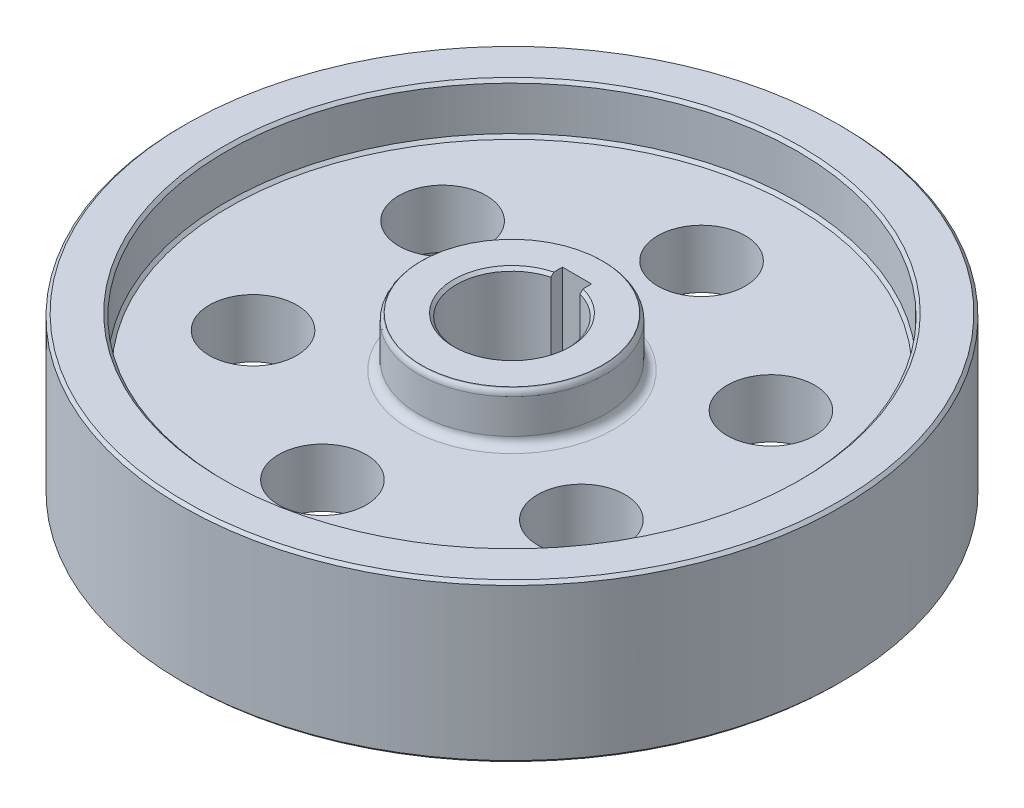
ISO-10303-21;
HEADER;
FILE_DESCRIPTION(('STEP AP214'),'2;1');
FILE_NAME('part.step','',(''),(''),'','','');
FILE_SCHEMA(('AUTOMOTIVE_DESIGN { 1 0 10303 214 1 1 1 1 }'));
ENDSEC;
DATA;
#1=APPLICATION_CONTEXT('core data for automotive mechanical design processes');
#2=APPLICATION_PROTOCOL_DEFINITION('international standard','automotive_design',2000,#1);
#3=PRODUCT_CONTEXT('',#1,'mechanical');
#4=PRODUCT('Part','Part','',(#3));
#5=PRODUCT_RELATED_PRODUCT_CATEGORY('part','',(#4));
#6=PRODUCT_DEFINITION_FORMATION('','',#4);
#7=PRODUCT_DEFINITION_CONTEXT('part definition',#1,'design');
#8=PRODUCT_DEFINITION('design','',#6,#7);
#9=PRODUCT_DEFINITION_SHAPE('','',#8);
#10=(LENGTH_UNIT() NAMED_UNIT(*) SI_UNIT(.MILLI.,.METRE.));
#11=(NAMED_UNIT(*) PLANE_ANGLE_UNIT() SI_UNIT($,.RADIAN.));
#12=(NAMED_UNIT(*) SI_UNIT($,.STERADIAN.) SOLID_ANGLE_UNIT());
#13=UNCERTAINTY_MEASURE_WITH_UNIT(LENGTH_MEASURE(1.E-05),#10,'distance_accuracy_value','');
#14=(GEOMETRIC_REPRESENTATION_CONTEXT(3) GLOBAL_UNCERTAINTY_ASSIGNED_CONTEXT((#13)) GLOBAL_UNIT_ASSIGNED_CONTEXT((#10,
#11,#12)) REPRESENTATION_CONTEXT('',''));
#15=CARTESIAN_POINT('',(0.,0.,0.));
#16=DIRECTION('',(0.,0.,1.));
#17=DIRECTION('',(1.,0.,0.));
#18=AXIS2_PLACEMENT_3D('',#15,#16,#17);
#19=CARTESIAN_POINT('',(0.,-35.6579930536552,0.));
#20=DIRECTION('',(0.,1.,0.));
#21=DIRECTION('',(0.,0.,1.));
#22=AXIS2_PLACEMENT_3D('',#19,#20,#21);
#23=PLANE('',#22);
#24=CARTESIAN_POINT('',(0.,-35.6579930536552,0.));
#25=DIRECTION('',(0.,1.,0.));
#26=DIRECTION('',(0.,0.,1.));
#27=AXIS2_PLACEMENT_3D('',#24,#25,#26);
#28=CIRCLE('',#27,31.0000000000001);
#29=CARTESIAN_POINT('',(0.,-35.6579930536552,31.0000000000001));
#30=VERTEX_POINT('',#29);
#31=EDGE_CURVE('E625',#30,#30,#28,.F.);
#32=ORIENTED_EDGE('',*,*,#31,.T.);
#33=EDGE_LOOP('',(#32));
#34=FACE_BOUND('',#33,.T.);
#35=DIRECTION('',(0.,0.,1.));
#36=VECTOR('',#35,1.);
#37=CARTESIAN_POINT('',(-5.,-35.6579930536552,-18.3303027798234));
#38=LINE('',#37,#36);
#39=CARTESIAN_POINT('',(-5.,-35.6579930536552,-22.3));
#40=VERTEX_POINT('',#39);
#41=CARTESIAN_POINT('',(-5.,-35.6579930536552,-19.364916731037));
#42=VERTEX_POINT('',#41);
#43=EDGE_CURVE('E104',#40,#42,#38,.T.);
#44=ORIENTED_EDGE('',*,*,#43,.T.);
#45=CARTESIAN_POINT('',(0.,-35.6579930536552,0.));
#46=DIRECTION('',(0.,1.,0.));
#47=DIRECTION('',(0.,0.,1.));
#48=AXIS2_PLACEMENT_3D('',#45,#46,#47);
#49=CIRCLE('',#48,19.9999999999999);
#50=CARTESIAN_POINT('',(5.,-35.6579930536552,-19.364916731037));
#51=VERTEX_POINT('',#50);
#52=EDGE_CURVE('E626',#42,#51,#49,.T.);
#53=ORIENTED_EDGE('',*,*,#52,.T.);
#54=DIRECTION('',(0.,0.,-1.));
#55=VECTOR('',#54,1.);
#56=CARTESIAN_POINT('',(5.,-35.6579930536552,-18.3303027798234));
#57=LINE('',#56,#55);
#58=CARTESIAN_POINT('',(5.,-35.6579930536552,-22.3));
#59=VERTEX_POINT('',#58);
#60=EDGE_CURVE('E102',#51,#59,#57,.T.);
#61=ORIENTED_EDGE('',*,*,#60,.T.);
#62=DIRECTION('',(-1.,0.,0.));
#63=VECTOR('',#62,1.);
#64=CARTESIAN_POINT('',(-5.,-35.6579930536552,-22.3));
#65=LINE('',#64,#63);
#66=EDGE_CURVE('E98',#59,#40,#65,.T.);
#67=ORIENTED_EDGE('',*,*,#66,.T.);
#68=EDGE_LOOP('',(#44,#53,#61,#67));
#69=FACE_BOUND('',#68,.T.);
#70=ADVANCED_FACE('F37',(#34,#69),#23,.F.);
#71=CARTESIAN_POINT('',(0.,18.3420069463448,0.));
#72=DIRECTION('',(0.,-1.,0.));
#73=DIRECTION('',(0.,0.,-1.));
#74=AXIS2_PLACEMENT_3D('',#71,#72,#73);
#75=PLANE('',#74);
#76=CARTESIAN_POINT('',(0.,18.3420069463448,0.));
#77=DIRECTION('',(0.,-1.,0.));
#78=DIRECTION('',(0.,0.,-1.));
#79=AXIS2_PLACEMENT_3D('',#76,#77,#78);
#80=CIRCLE('',#79,31.);
#81=CARTESIAN_POINT('',(0.,18.3420069463448,-31.));
#82=VERTEX_POINT('',#81);
#83=EDGE_CURVE('E667',#82,#82,#80,.F.);
#84=ORIENTED_EDGE('',*,*,#83,.T.);
#85=EDGE_LOOP('',(#84));
#86=FACE_BOUND('',#85,.T.);
#87=DIRECTION('',(0.,0.,-1.));
#88=VECTOR('',#87,1.);
#89=CARTESIAN_POINT('',(5.,18.3420069463448,-18.3303027798234));
#90=LINE('',#89,#88);
#91=CARTESIAN_POINT('',(5.,18.3420069463448,-19.3649167310371));
#92=VERTEX_POINT('',#91);
#93=CARTESIAN_POINT('',(5.,18.3420069463448,-22.3));
#94=VERTEX_POINT('',#93);
#95=EDGE_CURVE('E112',#92,#94,#90,.T.);
#96=ORIENTED_EDGE('',*,*,#95,.F.);
#97=CARTESIAN_POINT('',(0.,18.3420069463448,0.));
#98=DIRECTION('',(0.,-1.,0.));
#99=DIRECTION('',(0.,0.,-1.));
#100=AXIS2_PLACEMENT_3D('',#97,#98,#99);
#101=CIRCLE('',#100,20.);
#102=CARTESIAN_POINT('',(-5.,18.3420069463448,-19.3649167310371));
#103=VERTEX_POINT('',#102);
#104=EDGE_CURVE('E60',#92,#103,#101,.T.);
#105=ORIENTED_EDGE('',*,*,#104,.T.);
#106=DIRECTION('',(0.,0.,1.));
#107=VECTOR('',#106,1.);
#108=CARTESIAN_POINT('',(-5.,18.3420069463448,-18.3303027798234));
#109=LINE('',#108,#107);
#110=CARTESIAN_POINT('',(-5.,18.3420069463448,-22.3));
#111=VERTEX_POINT('',#110);
#112=EDGE_CURVE('E114',#111,#103,#109,.T.);
#113=ORIENTED_EDGE('',*,*,#112,.F.);
#114=DIRECTION('',(-1.,0.,0.));
#115=VECTOR('',#114,1.);
#116=CARTESIAN_POINT('',(-5.,18.3420069463448,-22.3));
#117=LINE('',#116,#115);
#118=EDGE_CURVE('E100',#94,#111,#117,.T.);
#119=ORIENTED_EDGE('',*,*,#118,.F.);
#120=EDGE_LOOP('',(#96,#105,#113,#119));
#121=FACE_BOUND('',#120,.T.);
#122=ADVANCED_FACE('F243',(#86,#121),#75,.F.);
#123=CARTESIAN_POINT('',(0.,-10.5374649583353,0.));
#124=DIRECTION('',(0.,1.,0.));
#125=DIRECTION('',(0.,0.,1.));
#126=AXIS2_PLACEMENT_3D('',#123,#124,#125);
#127=CYLINDRICAL_SURFACE('',#126,32.);
#128=CARTESIAN_POINT('',(0.,4.34200694634477,0.));
#129=DIRECTION('',(0.,-1.,0.));
#130=DIRECTION('',(0.,0.,-1.));
#131=AXIS2_PLACEMENT_3D('',#128,#129,#130);
#132=CIRCLE('',#131,32.);
#133=CARTESIAN_POINT('',(0.,4.34200694634477,-32.));
#134=VERTEX_POINT('',#133);
#135=EDGE_CURVE('E301',#134,#134,#132,.F.);
#136=ORIENTED_EDGE('',*,*,#135,.T.);
#137=EDGE_LOOP('',(#136));
#138=FACE_BOUND('',#137,.T.);
#139=CARTESIAN_POINT('',(0.,16.0993662592255,0.));
#140=DIRECTION('',(0.,1.,0.));
#141=DIRECTION('',(0.,0.,1.));
#142=AXIS2_PLACEMENT_3D('',#139,#140,#141);
#143=CIRCLE('',#142,32.);
#144=CARTESIAN_POINT('',(0.,16.0993662592255,32.));
#145=VERTEX_POINT('',#144);
#146=EDGE_CURVE('E304',#145,#145,#143,.F.);
#147=ORIENTED_EDGE('',*,*,#146,.T.);
#148=EDGE_LOOP('',(#147));
#149=FACE_BOUND('',#148,.T.);
#150=ADVANCED_FACE('F249',(#138,#149),#127,.T.);
#151=CARTESIAN_POINT('',(0.,1.34200694634477,-32.));
#152=DIRECTION('',(0.,-1.,0.));
#153=DIRECTION('',(0.,0.,-1.));
#154=AXIS2_PLACEMENT_3D('',#151,#152,#153);
#155=PLANE('',#154);
#156=CARTESIAN_POINT('',(0.,1.34200694634477,0.));
#157=DIRECTION('',(0.,-1.,0.));
#158=DIRECTION('',(0.,0.,-1.));
#159=AXIS2_PLACEMENT_3D('',#156,#157,#158);
#160=CIRCLE('',#159,35.);
#161=CARTESIAN_POINT('',(0.,1.34200694634477,-35.));
#162=VERTEX_POINT('',#161);
#163=EDGE_CURVE('E308',#162,#162,#160,.T.);
#164=ORIENTED_EDGE('',*,*,#163,.T.);
#165=EDGE_LOOP('',(#164));
#166=FACE_BOUND('',#165,.T.);
#167=CARTESIAN_POINT('',(0.,1.34200694634477,0.));
#168=DIRECTION('',(0.,-1.,0.));
#169=DIRECTION('',(0.,0.,-1.));
#170=AXIS2_PLACEMENT_3D('',#167,#168,#169);
#171=CIRCLE('',#170,97.);
#172=CARTESIAN_POINT('',(0.,1.34200694634477,-97.));
#173=VERTEX_POINT('',#172);
#174=EDGE_CURVE('E201',#173,#173,#171,.F.);
#175=ORIENTED_EDGE('',*,*,#174,.T.);
#176=EDGE_LOOP('',(#175));
#177=FACE_BOUND('',#176,.T.);
#178=CARTESIAN_POINT('',(-56.2916512459881,1.34200694634477,-32.5000000000007));
#179=DIRECTION('',(0.,1.,0.));
#180=DIRECTION('',(0.866025403784433,0.,0.50000000000001));
#181=AXIS2_PLACEMENT_3D('',#178,#179,#180);
#182=CIRCLE('',#181,15.);
#183=CARTESIAN_POINT('',(-43.3012701892216,1.34200694634477,-25.0000000000005));
#184=VERTEX_POINT('',#183);
#185=EDGE_CURVE('E384',#184,#184,#182,.T.);
#186=ORIENTED_EDGE('',*,*,#185,.F.);
#187=EDGE_LOOP('',(#186));
#188=FACE_BOUND('',#187,.T.);
#189=CARTESIAN_POINT('',(-56.2916512459888,1.34200694634477,32.4999999999995));
#190=DIRECTION('',(0.,1.,0.));
#191=DIRECTION('',(0.866025403784443,0.,-0.499999999999992));
#192=AXIS2_PLACEMENT_3D('',#189,#190,#191);
#193=CIRCLE('',#192,15.);
#194=CARTESIAN_POINT('',(-43.3012701892222,1.34200694634477,24.9999999999996));
#195=VERTEX_POINT('',#194);
#196=EDGE_CURVE('E383',#195,#195,#193,.T.);
#197=ORIENTED_EDGE('',*,*,#196,.F.);
#198=EDGE_LOOP('',(#197));
#199=FACE_BOUND('',#198,.T.);
#200=CARTESIAN_POINT('',(0.,1.34200694634477,65.));
#201=DIRECTION('',(0.,1.,0.));
#202=DIRECTION('',(0.,0.,-1.));
#203=AXIS2_PLACEMENT_3D('',#200,#201,#202);
#204=CIRCLE('',#203,15.);
#205=CARTESIAN_POINT('',(0.,1.34200694634477,50.));
#206=VERTEX_POINT('',#205);
#207=EDGE_CURVE('E388',#206,#206,#204,.T.);
#208=ORIENTED_EDGE('',*,*,#207,.F.);
#209=EDGE_LOOP('',(#208));
#210=FACE_BOUND('',#209,.T.);
#211=CARTESIAN_POINT('',(56.2916512459884,1.34200694634477,32.5000000000003));
#212=DIRECTION('',(0.,1.,0.));
#213=DIRECTION('',(-0.866025403784436,0.,-0.500000000000004));
#214=AXIS2_PLACEMENT_3D('',#211,#212,#213);
#215=CIRCLE('',#214,15.);
#216=CARTESIAN_POINT('',(43.3012701892218,1.34200694634477,25.0000000000002));
#217=VERTEX_POINT('',#216);
#218=EDGE_CURVE('E392',#217,#217,#215,.T.);
#219=ORIENTED_EDGE('',*,*,#218,.F.);
#220=EDGE_LOOP('',(#219));
#221=FACE_BOUND('',#220,.T.);
#222=CARTESIAN_POINT('',(56.2916512459886,1.34200694634477,-32.4999999999999));
#223=DIRECTION('',(0.,1.,0.));
#224=DIRECTION('',(-0.86602540378444,0.,0.499999999999998));
#225=AXIS2_PLACEMENT_3D('',#222,#223,#224);
#226=CIRCLE('',#225,15.);
#227=CARTESIAN_POINT('',(43.301270189222,1.34200694634477,-24.9999999999999));
#228=VERTEX_POINT('',#227);
#229=EDGE_CURVE('E378',#228,#228,#226,.T.);
#230=ORIENTED_EDGE('',*,*,#229,.F.);
#231=EDGE_LOOP('',(#230));
#232=FACE_BOUND('',#231,.T.);
#233=CARTESIAN_POINT('',(0.,1.34200694634477,-65.));
#234=DIRECTION('',(0.,1.,0.));
#235=DIRECTION('',(0.,0.,1.));
#236=AXIS2_PLACEMENT_3D('',#233,#234,#235);
#237=CIRCLE('',#236,15.);
#238=CARTESIAN_POINT('',(0.,1.34200694634477,-50.));
#239=VERTEX_POINT('',#238);
#240=EDGE_CURVE('E117',#239,#239,#237,.T.);
#241=ORIENTED_EDGE('',*,*,#240,.F.);
#242=EDGE_LOOP('',(#241));
#243=FACE_BOUND('',#242,.T.);
#244=ADVANCED_FACE('F286',(#166,#177,#188,#199,#210,#221,#232,#243),#155,.F.);
#245=CARTESIAN_POINT('',(0.,-10.5374649583353,0.));
#246=DIRECTION('',(0.,1.,0.));
#247=DIRECTION('',(0.,0.,1.));
#248=AXIS2_PLACEMENT_3D('',#245,#246,#247);
#249=CYLINDRICAL_SURFACE('',#248,98.);
#250=CARTESIAN_POINT('',(0.,2.34200694634471,0.));
#251=DIRECTION('',(0.,-1.,0.));
#252=DIRECTION('',(0.,0.,-1.));
#253=AXIS2_PLACEMENT_3D('',#250,#251,#252);
#254=CIRCLE('',#253,98.);
#255=CARTESIAN_POINT('',(0.,2.34200694634471,-98.));
#256=VERTEX_POINT('',#255);
#257=EDGE_CURVE('E631',#256,#256,#254,.T.);
#258=ORIENTED_EDGE('',*,*,#257,.T.);
#259=EDGE_LOOP('',(#258));
#260=FACE_BOUND('',#259,.T.);
#261=CARTESIAN_POINT('',(0.,17.3420069463447,0.));
#262=DIRECTION('',(0.,-1.,0.));
#263=DIRECTION('',(0.,0.,-1.));
#264=AXIS2_PLACEMENT_3D('',#261,#262,#263);
#265=CIRCLE('',#264,98.);
#266=CARTESIAN_POINT('',(0.,17.3420069463447,-98.));
#267=VERTEX_POINT('',#266);
#268=EDGE_CURVE('E651',#267,#267,#265,.F.);
#269=ORIENTED_EDGE('',*,*,#268,.T.);
#270=EDGE_LOOP('',(#269));
#271=FACE_BOUND('',#270,.T.);
#272=ADVANCED_FACE('F276',(#260,#271),#249,.F.);
#273=CARTESIAN_POINT('',(0.,18.3420069463448,-98.));
#274=DIRECTION('',(0.,-1.,0.));
#275=DIRECTION('',(0.,0.,-1.));
#276=AXIS2_PLACEMENT_3D('',#273,#274,#275);
#277=PLANE('',#276);
#278=CARTESIAN_POINT('',(0.,18.3420069463448,0.));
#279=DIRECTION('',(0.,-1.,0.));
#280=DIRECTION('',(0.,0.,-1.));
#281=AXIS2_PLACEMENT_3D('',#278,#279,#280);
#282=CIRCLE('',#281,99.);
#283=CARTESIAN_POINT('',(0.,18.3420069463448,-99.));
#284=VERTEX_POINT('',#283);
#285=EDGE_CURVE('E627',#284,#284,#282,.T.);
#286=ORIENTED_EDGE('',*,*,#285,.T.);
#287=EDGE_LOOP('',(#286));
#288=FACE_BOUND('',#287,.T.);
#289=CARTESIAN_POINT('',(0.,18.3420069463448,0.));
#290=DIRECTION('',(0.,-1.,0.));
#291=DIRECTION('',(0.,0.,-1.));
#292=AXIS2_PLACEMENT_3D('',#289,#290,#291);
#293=CIRCLE('',#292,112.);
#294=CARTESIAN_POINT('',(0.,18.3420069463448,-112.));
#295=VERTEX_POINT('',#294);
#296=EDGE_CURVE('E126',#295,#295,#293,.F.);
#297=ORIENTED_EDGE('',*,*,#296,.T.);
#298=EDGE_LOOP('',(#297));
#299=FACE_BOUND('',#298,.T.);
#300=ADVANCED_FACE('F273',(#288,#299),#277,.F.);
#301=CARTESIAN_POINT('',(0.,-10.5374649583353,0.));
#302=DIRECTION('',(0.,1.,0.));
#303=DIRECTION('',(0.,0.,1.));
#304=AXIS2_PLACEMENT_3D('',#301,#302,#303);
#305=CYLINDRICAL_SURFACE('',#304,113.);
#306=CARTESIAN_POINT('',(0.,17.3420069463448,0.));
#307=DIRECTION('',(0.,-1.,0.));
#308=DIRECTION('',(0.,0.,-1.));
#309=AXIS2_PLACEMENT_3D('',#306,#307,#308);
#310=CIRCLE('',#309,113.);
#311=CARTESIAN_POINT('',(0.,17.3420069463448,-113.));
#312=VERTEX_POINT('',#311);
#313=EDGE_CURVE('E139',#312,#312,#310,.T.);
#314=ORIENTED_EDGE('',*,*,#313,.T.);
#315=EDGE_LOOP('',(#314));
#316=FACE_BOUND('',#315,.T.);
#317=CARTESIAN_POINT('',(0.,-34.6579930536552,0.));
#318=DIRECTION('',(0.,1.,0.));
#319=DIRECTION('',(0.,0.,1.));
#320=AXIS2_PLACEMENT_3D('',#317,#318,#319);
#321=CIRCLE('',#320,113.);
#322=CARTESIAN_POINT('',(0.,-34.6579930536552,113.));
#323=VERTEX_POINT('',#322);
#324=EDGE_CURVE('E136',#323,#323,#321,.T.);
#325=ORIENTED_EDGE('',*,*,#324,.T.);
#326=EDGE_LOOP('',(#325));
#327=FACE_BOUND('',#326,.T.);
#328=ADVANCED_FACE('F275',(#316,#327),#305,.T.);
#329=CARTESIAN_POINT('',(0.,-35.6579930536552,-98.));
#330=DIRECTION('',(0.,1.,0.));
#331=DIRECTION('',(0.,0.,1.));
#332=AXIS2_PLACEMENT_3D('',#329,#330,#331);
#333=PLANE('',#332);
#334=CARTESIAN_POINT('',(0.,-35.6579930536552,0.));
#335=DIRECTION('',(0.,1.,0.));
#336=DIRECTION('',(0.,0.,1.));
#337=AXIS2_PLACEMENT_3D('',#334,#335,#336);
#338=CIRCLE('',#337,99.);
#339=CARTESIAN_POINT('',(0.,-35.6579930536552,99.));
#340=VERTEX_POINT('',#339);
#341=EDGE_CURVE('E306',#340,#340,#338,.T.);
#342=ORIENTED_EDGE('',*,*,#341,.T.);
#343=EDGE_LOOP('',(#342));
#344=FACE_BOUND('',#343,.T.);
#345=CARTESIAN_POINT('',(0.,-35.6579930536552,0.));
#346=DIRECTION('',(0.,1.,0.));
#347=DIRECTION('',(0.,0.,1.));
#348=AXIS2_PLACEMENT_3D('',#345,#346,#347);
#349=CIRCLE('',#348,112.);
#350=CARTESIAN_POINT('',(0.,-35.6579930536552,112.));
#351=VERTEX_POINT('',#350);
#352=EDGE_CURVE('E142',#351,#351,#349,.F.);
#353=ORIENTED_EDGE('',*,*,#352,.T.);
#354=EDGE_LOOP('',(#353));
#355=FACE_BOUND('',#354,.T.);
#356=ADVANCED_FACE('F283',(#344,#355),#333,.F.);
#357=CARTESIAN_POINT('',(0.,-10.5374649583353,0.));
#358=DIRECTION('',(0.,1.,0.));
#359=DIRECTION('',(0.,0.,1.));
#360=AXIS2_PLACEMENT_3D('',#357,#358,#359);
#361=CYLINDRICAL_SURFACE('',#360,98.);
#362=CARTESIAN_POINT('',(0.,-19.6579930536553,0.));
#363=DIRECTION('',(0.,1.,0.));
#364=DIRECTION('',(0.,0.,1.));
#365=AXIS2_PLACEMENT_3D('',#362,#363,#364);
#366=CIRCLE('',#365,98.);
#367=CARTESIAN_POINT('',(0.,-19.6579930536553,98.));
#368=VERTEX_POINT('',#367);
#369=EDGE_CURVE('E637',#368,#368,#366,.T.);
#370=ORIENTED_EDGE('',*,*,#369,.T.);
#371=EDGE_LOOP('',(#370));
#372=FACE_BOUND('',#371,.T.);
#373=CARTESIAN_POINT('',(0.,-34.6579930536552,0.));
#374=DIRECTION('',(0.,1.,0.));
#375=DIRECTION('',(0.,0.,1.));
#376=AXIS2_PLACEMENT_3D('',#373,#374,#375);
#377=CIRCLE('',#376,98.);
#378=CARTESIAN_POINT('',(0.,-34.6579930536552,98.));
#379=VERTEX_POINT('',#378);
#380=EDGE_CURVE('E629',#379,#379,#377,.F.);
#381=ORIENTED_EDGE('',*,*,#380,.T.);
#382=EDGE_LOOP('',(#381));
#383=FACE_BOUND('',#382,.T.);
#384=ADVANCED_FACE('F340',(#372,#383),#361,.F.);
#385=CARTESIAN_POINT('',(0.,-18.6579930536552,-98.));
#386=DIRECTION('',(0.,1.,0.));
#387=DIRECTION('',(0.,0.,1.));
#388=AXIS2_PLACEMENT_3D('',#385,#386,#387);
#389=PLANE('',#388);
#390=CARTESIAN_POINT('',(0.,-18.6579930536552,0.));
#391=DIRECTION('',(0.,1.,0.));
#392=DIRECTION('',(0.,0.,1.));
#393=AXIS2_PLACEMENT_3D('',#390,#391,#392);
#394=CIRCLE('',#393,35.);
#395=CARTESIAN_POINT('',(0.,-18.6579930536552,35.));
#396=VERTEX_POINT('',#395);
#397=EDGE_CURVE('E320',#396,#396,#394,.T.);
#398=ORIENTED_EDGE('',*,*,#397,.T.);
#399=EDGE_LOOP('',(#398));
#400=FACE_BOUND('',#399,.T.);
#401=CARTESIAN_POINT('',(0.,-18.6579930536552,0.));
#402=DIRECTION('',(0.,1.,0.));
#403=DIRECTION('',(0.,0.,1.));
#404=AXIS2_PLACEMENT_3D('',#401,#402,#403);
#405=CIRCLE('',#404,97.);
#406=CARTESIAN_POINT('',(0.,-18.6579930536552,97.));
#407=VERTEX_POINT('',#406);
#408=EDGE_CURVE('E311',#407,#407,#405,.F.);
#409=ORIENTED_EDGE('',*,*,#408,.T.);
#410=EDGE_LOOP('',(#409));
#411=FACE_BOUND('',#410,.T.);
#412=CARTESIAN_POINT('',(-56.2916512459881,-18.6579930536552,-32.5000000000007));
#413=DIRECTION('',(0.,1.,0.));
#414=DIRECTION('',(0.866025403784433,0.,0.50000000000001));
#415=AXIS2_PLACEMENT_3D('',#412,#413,#414);
#416=CIRCLE('',#415,15.);
#417=CARTESIAN_POINT('',(-43.3012701892216,-18.6579930536552,-25.0000000000005));
#418=VERTEX_POINT('',#417);
#419=EDGE_CURVE('E348',#418,#418,#416,.T.);
#420=ORIENTED_EDGE('',*,*,#419,.T.);
#421=EDGE_LOOP('',(#420));
#422=FACE_BOUND('',#421,.T.);
#423=CARTESIAN_POINT('',(-56.2916512459888,-18.6579930536552,32.4999999999995));
#424=DIRECTION('',(0.,1.,0.));
#425=DIRECTION('',(0.866025403784443,0.,-0.499999999999992));
#426=AXIS2_PLACEMENT_3D('',#423,#424,#425);
#427=CIRCLE('',#426,15.);
#428=CARTESIAN_POINT('',(-43.3012701892222,-18.6579930536552,24.9999999999996));
#429=VERTEX_POINT('',#428);
#430=EDGE_CURVE('E352',#429,#429,#427,.T.);
#431=ORIENTED_EDGE('',*,*,#430,.T.);
#432=EDGE_LOOP('',(#431));
#433=FACE_BOUND('',#432,.T.);
#434=CARTESIAN_POINT('',(0.,-18.6579930536552,65.));
#435=DIRECTION('',(0.,1.,0.));
#436=DIRECTION('',(0.,0.,-1.));
#437=AXIS2_PLACEMENT_3D('',#434,#435,#436);
#438=CIRCLE('',#437,15.);
#439=CARTESIAN_POINT('',(0.,-18.6579930536552,50.));
#440=VERTEX_POINT('',#439);
#441=EDGE_CURVE('E356',#440,#440,#438,.T.);
#442=ORIENTED_EDGE('',*,*,#441,.T.);
#443=EDGE_LOOP('',(#442));
#444=FACE_BOUND('',#443,.T.);
#445=CARTESIAN_POINT('',(56.2916512459884,-18.6579930536552,32.5000000000003));
#446=DIRECTION('',(0.,1.,0.));
#447=DIRECTION('',(-0.866025403784436,0.,-0.500000000000004));
#448=AXIS2_PLACEMENT_3D('',#445,#446,#447);
#449=CIRCLE('',#448,15.);
#450=CARTESIAN_POINT('',(43.3012701892218,-18.6579930536552,25.0000000000002));
#451=VERTEX_POINT('',#450);
#452=EDGE_CURVE('E360',#451,#451,#449,.T.);
#453=ORIENTED_EDGE('',*,*,#452,.T.);
#454=EDGE_LOOP('',(#453));
#455=FACE_BOUND('',#454,.T.);
#456=CARTESIAN_POINT('',(56.2916512459886,-18.6579930536552,-32.4999999999999));
#457=DIRECTION('',(0.,1.,0.));
#458=DIRECTION('',(-0.86602540378444,0.,0.499999999999998));
#459=AXIS2_PLACEMENT_3D('',#456,#457,#458);
#460=CIRCLE('',#459,15.);
#461=CARTESIAN_POINT('',(43.301270189222,-18.6579930536552,-24.9999999999999));
#462=VERTEX_POINT('',#461);
#463=EDGE_CURVE('E364',#462,#462,#460,.T.);
#464=ORIENTED_EDGE('',*,*,#463,.T.);
#465=EDGE_LOOP('',(#464));
#466=FACE_BOUND('',#465,.T.);
#467=CARTESIAN_POINT('',(0.,-18.6579930536552,-65.));
#468=DIRECTION('',(0.,1.,0.));
#469=DIRECTION('',(0.,0.,1.));
#470=AXIS2_PLACEMENT_3D('',#467,#468,#469);
#471=CIRCLE('',#470,15.);
#472=CARTESIAN_POINT('',(0.,-18.6579930536552,-50.));
#473=VERTEX_POINT('',#472);
#474=EDGE_CURVE('E122',#473,#473,#471,.T.);
#475=ORIENTED_EDGE('',*,*,#474,.T.);
#476=EDGE_LOOP('',(#475));
#477=FACE_BOUND('',#476,.T.);
#478=ADVANCED_FACE('F337',(#400,#411,#422,#433,#444,#455,#466,#477),#389,.F.);
#479=CARTESIAN_POINT('',(0.,-10.5374649583353,0.));
#480=DIRECTION('',(0.,1.,0.));
#481=DIRECTION('',(0.,0.,1.));
#482=AXIS2_PLACEMENT_3D('',#479,#480,#481);
#483=CYLINDRICAL_SURFACE('',#482,32.);
#484=CARTESIAN_POINT('',(0.,-21.6579930536552,0.));
#485=DIRECTION('',(0.,1.,0.));
#486=DIRECTION('',(0.,0.,1.));
#487=AXIS2_PLACEMENT_3D('',#484,#485,#486);
#488=CIRCLE('',#487,32.);
#489=CARTESIAN_POINT('',(0.,-21.6579930536552,32.));
#490=VERTEX_POINT('',#489);
#491=EDGE_CURVE('E45',#490,#490,#488,.F.);
#492=ORIENTED_EDGE('',*,*,#491,.T.);
#493=EDGE_LOOP('',(#492));
#494=FACE_BOUND('',#493,.T.);
#495=CARTESIAN_POINT('',(0.,-33.415352366536,0.));
#496=DIRECTION('',(0.,-1.,0.));
#497=DIRECTION('',(0.,0.,-1.));
#498=AXIS2_PLACEMENT_3D('',#495,#496,#497);
#499=CIRCLE('',#498,32.);
#500=CARTESIAN_POINT('',(0.,-33.415352366536,-32.));
#501=VERTEX_POINT('',#500);
#502=EDGE_CURVE('E323',#501,#501,#499,.F.);
#503=ORIENTED_EDGE('',*,*,#502,.T.);
#504=EDGE_LOOP('',(#503));
#505=FACE_BOUND('',#504,.T.);
#506=ADVANCED_FACE('F328',(#494,#505),#483,.T.);
#507=CARTESIAN_POINT('',(-5.,-35.6579930536552,-22.3));
#508=DIRECTION('',(0.,0.,-1.));
#509=DIRECTION('',(0.,1.,0.));
#510=AXIS2_PLACEMENT_3D('',#507,#508,#509);
#511=PLANE('',#510);
#512=ORIENTED_EDGE('',*,*,#118,.T.);
#513=DIRECTION('',(0.,1.,0.));
#514=VECTOR('',#513,1.);
#515=CARTESIAN_POINT('',(-5.,-35.6579930536552,-22.3));
#516=LINE('',#515,#514);
#517=EDGE_CURVE('E94',#40,#111,#516,.T.);
#518=ORIENTED_EDGE('',*,*,#517,.F.);
#519=ORIENTED_EDGE('',*,*,#66,.F.);
#520=DIRECTION('',(0.,1.,0.));
#521=VECTOR('',#520,1.);
#522=CARTESIAN_POINT('',(5.,-35.6579930536552,-22.3));
#523=LINE('',#522,#521);
#524=EDGE_CURVE('E124',#59,#94,#523,.T.);
#525=ORIENTED_EDGE('',*,*,#524,.T.);
#526=EDGE_LOOP('',(#512,#518,#519,#525));
#527=FACE_BOUND('',#526,.T.);
#528=ADVANCED_FACE('F95',(#527),#511,.F.);
#529=CARTESIAN_POINT('',(5.,-35.6579930536552,-18.3303027798234));
#530=DIRECTION('',(1.,0.,0.));
#531=DIRECTION('',(0.,0.,-1.));
#532=AXIS2_PLACEMENT_3D('',#529,#530,#531);
#533=PLANE('',#532);
#534=DIRECTION('',(0.,1.,0.));
#535=VECTOR('',#534,1.);
#536=CARTESIAN_POINT('',(5.,-35.6579930536552,-18.3303027798234));
#537=LINE('',#536,#535);
#538=CARTESIAN_POINT('',(5.,-34.6579930536553,-18.3303027798234));
#539=VERTEX_POINT('',#538);
#540=CARTESIAN_POINT('',(5.,17.3420069463448,-18.3303027798234));
#541=VERTEX_POINT('',#540);
#542=EDGE_CURVE('E127',#539,#541,#537,.T.);
#543=ORIENTED_EDGE('',*,*,#542,.T.);
#544=CARTESIAN_POINT('',(5.,17.3420069463448,-18.3303027798234));
#545=CARTESIAN_POINT('',(5.,17.50851801214,-18.5028888352026));
#546=CARTESIAN_POINT('',(5.,17.6751068788063,-18.6753996926097));
#547=CARTESIAN_POINT('',(5.,18.0084402121413,-19.0202710096794));
#548=CARTESIAN_POINT('',(5.,18.1751846788083,-19.1926314693435));
#549=CARTESIAN_POINT('',(5.,18.3420069463448,-19.3649167310371));
#550=B_SPLINE_CURVE_WITH_KNOTS('',3,(#544,#545,#546,#547,#548,#549),.UNSPECIFIED.,.F.,.F.,(4,2,
4),(0.,0.719448829163402,1.43889765081594),.UNSPECIFIED.);
#551=EDGE_CURVE('E158',#541,#92,#550,.T.);
#552=ORIENTED_EDGE('',*,*,#551,.T.);
#553=ORIENTED_EDGE('',*,*,#95,.T.);
#554=ORIENTED_EDGE('',*,*,#524,.F.);
#555=ORIENTED_EDGE('',*,*,#60,.F.);
#556=CARTESIAN_POINT('',(5.,-35.6579930536552,-19.364916731037));
#557=CARTESIAN_POINT('',(5.,-35.4911707861188,-19.1926314693435));
#558=CARTESIAN_POINT('',(5.,-35.3244263194518,-19.0202710096794));
#559=CARTESIAN_POINT('',(5.,-34.9910929861168,-18.6753996926097));
#560=CARTESIAN_POINT('',(5.,-34.8245041194505,-18.5028888352026));
#561=CARTESIAN_POINT('',(5.,-34.6579930536553,-18.3303027798234));
#562=B_SPLINE_CURVE_WITH_KNOTS('',3,(#556,#557,#558,#559,#560,#561),.UNSPECIFIED.,.F.,.F.,(4,2,
4),(0.,0.719448821652494,1.43889765081586),.UNSPECIFIED.);
#563=EDGE_CURVE('E150',#51,#539,#562,.T.);
#564=ORIENTED_EDGE('',*,*,#563,.T.);
#565=EDGE_LOOP('',(#543,#552,#553,#554,#555,#564));
#566=FACE_BOUND('',#565,.T.);
#567=ADVANCED_FACE('F170',(#566),#533,.F.);
#568=CARTESIAN_POINT('',(0.,-35.6579930536552,0.));
#569=DIRECTION('',(0.,1.,0.));
#570=DIRECTION('',(0.,0.,1.));
#571=AXIS2_PLACEMENT_3D('',#568,#569,#570);
#572=CYLINDRICAL_SURFACE('',#571,19.);
#573=DIRECTION('',(0.,1.,0.));
#574=VECTOR('',#573,1.);
#575=CARTESIAN_POINT('',(-5.,-35.6579930536552,-18.3303027798234));
#576=LINE('',#575,#574);
#577=CARTESIAN_POINT('',(-5.,-34.6579930536553,-18.3303027798234));
#578=VERTEX_POINT('',#577);
#579=CARTESIAN_POINT('',(-5.,17.3420069463448,-18.3303027798234));
#580=VERTEX_POINT('',#579);
#581=EDGE_CURVE('E101',#578,#580,#576,.T.);
#582=ORIENTED_EDGE('',*,*,#581,.T.);
#583=CARTESIAN_POINT('',(0.,17.3420069463448,0.));
#584=DIRECTION('',(0.,-1.,0.));
#585=DIRECTION('',(0.,0.,-1.));
#586=AXIS2_PLACEMENT_3D('',#583,#584,#585);
#587=CIRCLE('',#586,19.);
#588=EDGE_CURVE('E147',#580,#541,#587,.F.);
#589=ORIENTED_EDGE('',*,*,#588,.T.);
#590=ORIENTED_EDGE('',*,*,#542,.F.);
#591=CARTESIAN_POINT('',(0.,-34.6579930536553,0.));
#592=DIRECTION('',(0.,1.,0.));
#593=DIRECTION('',(0.,0.,1.));
#594=AXIS2_PLACEMENT_3D('',#591,#592,#593);
#595=CIRCLE('',#594,19.);
#596=EDGE_CURVE('E145',#539,#578,#595,.F.);
#597=ORIENTED_EDGE('',*,*,#596,.T.);
#598=EDGE_LOOP('',(#582,#589,#590,#597));
#599=FACE_BOUND('',#598,.T.);
#600=ADVANCED_FACE('F175',(#599),#572,.F.);
#601=CARTESIAN_POINT('',(-5.,-35.6579930536552,-18.3303027798234));
#602=DIRECTION('',(-1.,0.,0.));
#603=DIRECTION('',(0.,0.,1.));
#604=AXIS2_PLACEMENT_3D('',#601,#602,#603);
#605=PLANE('',#604);
#606=ORIENTED_EDGE('',*,*,#112,.T.);
#607=CARTESIAN_POINT('',(-5.,18.3420069463448,-19.3649167310371));
#608=CARTESIAN_POINT('',(-5.,18.1751846788083,-19.1926314693435));
#609=CARTESIAN_POINT('',(-5.,18.0084402121413,-19.0202710096794));
#610=CARTESIAN_POINT('',(-5.,17.6751068788063,-18.6753996926097));
#611=CARTESIAN_POINT('',(-5.,17.50851801214,-18.5028888352026));
#612=CARTESIAN_POINT('',(-5.,17.3420069463448,-18.3303027798234));
#613=B_SPLINE_CURVE_WITH_KNOTS('',3,(#607,#608,#609,#610,#611,#612),.UNSPECIFIED.,.F.,.F.,(4,2,
4),(0.,0.719448821652538,1.43889765081594),.UNSPECIFIED.);
#614=EDGE_CURVE('E195',#103,#580,#613,.T.);
#615=ORIENTED_EDGE('',*,*,#614,.T.);
#616=ORIENTED_EDGE('',*,*,#581,.F.);
#617=CARTESIAN_POINT('',(-5.,-34.6579930536553,-18.3303027798234));
#618=CARTESIAN_POINT('',(-5.,-34.8245041194505,-18.5028888352026));
#619=CARTESIAN_POINT('',(-5.,-34.9910929861168,-18.6753996926097));
#620=CARTESIAN_POINT('',(-5.,-35.3244263194518,-19.0202710096794));
#621=CARTESIAN_POINT('',(-5.,-35.4911707861188,-19.1926314693435));
#622=CARTESIAN_POINT('',(-5.,-35.6579930536552,-19.364916731037));
#623=B_SPLINE_CURVE_WITH_KNOTS('',3,(#617,#618,#619,#620,#621,#622),.UNSPECIFIED.,.F.,.F.,(4,2,
4),(0.,0.719448829163363,1.43889765081586),.UNSPECIFIED.);
#624=EDGE_CURVE('E52',#578,#42,#623,.T.);
#625=ORIENTED_EDGE('',*,*,#624,.T.);
#626=ORIENTED_EDGE('',*,*,#43,.F.);
#627=ORIENTED_EDGE('',*,*,#517,.T.);
#628=EDGE_LOOP('',(#606,#615,#616,#625,#626,#627));
#629=FACE_BOUND('',#628,.T.);
#630=ADVANCED_FACE('F105',(#629),#605,.F.);
#631=CARTESIAN_POINT('',(0.,-35.6579930536552,-65.));
#632=DIRECTION('',(0.,1.,0.));
#633=DIRECTION('',(0.,0.,1.));
#634=AXIS2_PLACEMENT_3D('',#631,#632,#633);
#635=CYLINDRICAL_SURFACE('',#634,15.);
#636=ORIENTED_EDGE('',*,*,#240,.T.);
#637=EDGE_LOOP('',(#636));
#638=FACE_BOUND('',#637,.T.);
#639=ORIENTED_EDGE('',*,*,#474,.F.);
#640=EDGE_LOOP('',(#639));
#641=FACE_BOUND('',#640,.T.);
#642=ADVANCED_FACE('F177',(#638,#641),#635,.F.);
#643=CARTESIAN_POINT('',(56.2916512459886,-35.6579930536552,-32.4999999999999));
#644=DIRECTION('',(0.,1.,0.));
#645=DIRECTION('',(-0.86602540378444,0.,0.499999999999998));
#646=AXIS2_PLACEMENT_3D('',#643,#644,#645);
#647=CYLINDRICAL_SURFACE('',#646,15.);
#648=ORIENTED_EDGE('',*,*,#229,.T.);
#649=EDGE_LOOP('',(#648));
#650=FACE_BOUND('',#649,.T.);
#651=ORIENTED_EDGE('',*,*,#463,.F.);
#652=EDGE_LOOP('',(#651));
#653=FACE_BOUND('',#652,.T.);
#654=ADVANCED_FACE('F368',(#650,#653),#647,.F.);
#655=CARTESIAN_POINT('',(56.2916512459884,-35.6579930536552,32.5000000000003));
#656=DIRECTION('',(0.,1.,0.));
#657=DIRECTION('',(-0.866025403784436,0.,-0.500000000000004));
#658=AXIS2_PLACEMENT_3D('',#655,#656,#657);
#659=CYLINDRICAL_SURFACE('',#658,15.);
#660=ORIENTED_EDGE('',*,*,#218,.T.);
#661=EDGE_LOOP('',(#660));
#662=FACE_BOUND('',#661,.T.);
#663=ORIENTED_EDGE('',*,*,#452,.F.);
#664=EDGE_LOOP('',(#663));
#665=FACE_BOUND('',#664,.T.);
#666=ADVANCED_FACE('F373',(#662,#665),#659,.F.);
#667=CARTESIAN_POINT('',(0.,-35.6579930536552,65.));
#668=DIRECTION('',(0.,1.,0.));
#669=DIRECTION('',(0.,0.,-1.));
#670=AXIS2_PLACEMENT_3D('',#667,#668,#669);
#671=CYLINDRICAL_SURFACE('',#670,15.);
#672=ORIENTED_EDGE('',*,*,#207,.T.);
#673=EDGE_LOOP('',(#672));
#674=FACE_BOUND('',#673,.T.);
#675=ORIENTED_EDGE('',*,*,#441,.F.);
#676=EDGE_LOOP('',(#675));
#677=FACE_BOUND('',#676,.T.);
#678=ADVANCED_FACE('F405',(#674,#677),#671,.F.);
#679=CARTESIAN_POINT('',(-56.2916512459888,-35.6579930536552,32.4999999999995));
#680=DIRECTION('',(0.,1.,0.));
#681=DIRECTION('',(0.866025403784443,0.,-0.499999999999992));
#682=AXIS2_PLACEMENT_3D('',#679,#680,#681);
#683=CYLINDRICAL_SURFACE('',#682,15.);
#684=ORIENTED_EDGE('',*,*,#196,.T.);
#685=EDGE_LOOP('',(#684));
#686=FACE_BOUND('',#685,.T.);
#687=ORIENTED_EDGE('',*,*,#430,.F.);
#688=EDGE_LOOP('',(#687));
#689=FACE_BOUND('',#688,.T.);
#690=ADVANCED_FACE('F266',(#686,#689),#683,.F.);
#691=CARTESIAN_POINT('',(-56.2916512459881,-35.6579930536552,-32.5000000000007));
#692=DIRECTION('',(0.,1.,0.));
#693=DIRECTION('',(0.866025403784433,0.,0.50000000000001));
#694=AXIS2_PLACEMENT_3D('',#691,#692,#693);
#695=CYLINDRICAL_SURFACE('',#694,15.);
#696=ORIENTED_EDGE('',*,*,#185,.T.);
#697=EDGE_LOOP('',(#696));
#698=FACE_BOUND('',#697,.T.);
#699=ORIENTED_EDGE('',*,*,#419,.F.);
#700=EDGE_LOOP('',(#699));
#701=FACE_BOUND('',#700,.T.);
#702=ADVANCED_FACE('F259',(#698,#701),#695,.F.);
#703=CARTESIAN_POINT('',(0.,18.3420069463448,0.));
#704=DIRECTION('',(0.,-1.,0.));
#705=DIRECTION('',(0.,0.,-1.));
#706=AXIS2_PLACEMENT_3D('',#703,#704,#705);
#707=CONICAL_SURFACE('',#706,112.,0.785398163397462);
#708=ORIENTED_EDGE('',*,*,#313,.F.);
#709=EDGE_LOOP('',(#708));
#710=FACE_BOUND('',#709,.T.);
#711=ORIENTED_EDGE('',*,*,#296,.F.);
#712=EDGE_LOOP('',(#711));
#713=FACE_BOUND('',#712,.T.);
#714=ADVANCED_FACE('F255',(#710,#713),#707,.T.);
#715=CARTESIAN_POINT('',(0.,-34.6579930536552,0.));
#716=DIRECTION('',(0.,1.,0.));
#717=DIRECTION('',(0.,0.,1.));
#718=AXIS2_PLACEMENT_3D('',#715,#716,#717);
#719=CONICAL_SURFACE('',#718,113.,0.785398163397462);
#720=ORIENTED_EDGE('',*,*,#352,.F.);
#721=EDGE_LOOP('',(#720));
#722=FACE_BOUND('',#721,.T.);
#723=ORIENTED_EDGE('',*,*,#324,.F.);
#724=EDGE_LOOP('',(#723));
#725=FACE_BOUND('',#724,.T.);
#726=ADVANCED_FACE('F214',(#722,#725),#719,.T.);
#727=CARTESIAN_POINT('',(0.,17.3420069463448,0.));
#728=DIRECTION('',(0.,1.,0.));
#729=DIRECTION('',(0.,0.,1.));
#730=AXIS2_PLACEMENT_3D('',#727,#728,#729);
#731=CONICAL_SURFACE('',#730,19.,0.785398163397443);
#732=ORIENTED_EDGE('',*,*,#614,.F.);
#733=ORIENTED_EDGE('',*,*,#104,.F.);
#734=ORIENTED_EDGE('',*,*,#551,.F.);
#735=ORIENTED_EDGE('',*,*,#588,.F.);
#736=EDGE_LOOP('',(#732,#733,#734,#735));
#737=FACE_BOUND('',#736,.T.);
#738=ADVANCED_FACE('F204',(#737),#731,.F.);
#739=CARTESIAN_POINT('',(0.,18.3420069463448,0.));
#740=DIRECTION('',(0.,-1.,0.));
#741=DIRECTION('',(0.,0.,-1.));
#742=AXIS2_PLACEMENT_3D('',#739,#740,#741);
#743=CONICAL_SURFACE('',#742,31.,0.785398163397448);
#744=CARTESIAN_POINT('',(0.,18.2206866027851,0.));
#745=DIRECTION('',(0.,-1.,0.));
#746=DIRECTION('',(0.,0.,-1.));
#747=AXIS2_PLACEMENT_3D('',#744,#745,#746);
#748=CIRCLE('',#747,31.1213203435596);
#749=CARTESIAN_POINT('',(0.,18.2206866027851,-31.1213203435596));
#750=VERTEX_POINT('',#749);
#751=EDGE_CURVE('E317',#750,#750,#748,.F.);
#752=ORIENTED_EDGE('',*,*,#751,.T.);
#753=EDGE_LOOP('',(#752));
#754=FACE_BOUND('',#753,.T.);
#755=ORIENTED_EDGE('',*,*,#83,.F.);
#756=EDGE_LOOP('',(#755));
#757=FACE_BOUND('',#756,.T.);
#758=ADVANCED_FACE('F213',(#754,#757),#743,.T.);
#759=CARTESIAN_POINT('',(0.,1.34200694634477,0.));
#760=DIRECTION('',(0.,1.,0.));
#761=DIRECTION('',(0.,0.,1.));
#762=AXIS2_PLACEMENT_3D('',#759,#760,#761);
#763=CONICAL_SURFACE('',#762,97.,0.785398163397462);
#764=ORIENTED_EDGE('',*,*,#257,.F.);
#765=EDGE_LOOP('',(#764));
#766=FACE_BOUND('',#765,.T.);
#767=ORIENTED_EDGE('',*,*,#174,.F.);
#768=EDGE_LOOP('',(#767));
#769=FACE_BOUND('',#768,.T.);
#770=ADVANCED_FACE('F223',(#766,#769),#763,.F.);
#771=CARTESIAN_POINT('',(0.,17.3420069463447,0.));
#772=DIRECTION('',(0.,1.,0.));
#773=DIRECTION('',(0.,0.,1.));
#774=AXIS2_PLACEMENT_3D('',#771,#772,#773);
#775=CONICAL_SURFACE('',#774,98.,0.785398163397435);
#776=ORIENTED_EDGE('',*,*,#285,.F.);
#777=EDGE_LOOP('',(#776));
#778=FACE_BOUND('',#777,.T.);
#779=ORIENTED_EDGE('',*,*,#268,.F.);
#780=EDGE_LOOP('',(#779));
#781=FACE_BOUND('',#780,.T.);
#782=ADVANCED_FACE('F229',(#778,#781),#775,.F.);
#783=CARTESIAN_POINT('',(0.,-35.6579930536552,0.));
#784=DIRECTION('',(0.,-1.,0.));
#785=DIRECTION('',(0.,0.,-1.));
#786=AXIS2_PLACEMENT_3D('',#783,#784,#785);
#787=CONICAL_SURFACE('',#786,19.9999999999999,0.78539816339744);
#788=ORIENTED_EDGE('',*,*,#624,.F.);
#789=ORIENTED_EDGE('',*,*,#596,.F.);
#790=ORIENTED_EDGE('',*,*,#563,.F.);
#791=ORIENTED_EDGE('',*,*,#52,.F.);
#792=EDGE_LOOP('',(#788,#789,#790,#791));
#793=FACE_BOUND('',#792,.T.);
#794=ADVANCED_FACE('F166',(#793),#787,.F.);
#795=CARTESIAN_POINT('',(0.,-34.6579930536553,0.));
#796=DIRECTION('',(0.,1.,0.));
#797=DIRECTION('',(0.,0.,1.));
#798=AXIS2_PLACEMENT_3D('',#795,#796,#797);
#799=CONICAL_SURFACE('',#798,32.,0.785398163397462);
#800=CARTESIAN_POINT('',(0.,-35.5366727100957,0.));
#801=DIRECTION('',(0.,1.,0.));
#802=DIRECTION('',(0.,0.,1.));
#803=AXIS2_PLACEMENT_3D('',#800,#801,#802);
#804=CIRCLE('',#803,31.1213203435596);
#805=CARTESIAN_POINT('',(0.,-35.5366727100957,31.1213203435596));
#806=VERTEX_POINT('',#805);
#807=EDGE_CURVE('E11',#806,#806,#804,.F.);
#808=ORIENTED_EDGE('',*,*,#807,.T.);
#809=EDGE_LOOP('',(#808));
#810=FACE_BOUND('',#809,.T.);
#811=ORIENTED_EDGE('',*,*,#31,.F.);
#812=EDGE_LOOP('',(#811));
#813=FACE_BOUND('',#812,.T.);
#814=ADVANCED_FACE('F238',(#810,#813),#799,.T.);
#815=CARTESIAN_POINT('',(0.,-19.6579930536553,0.));
#816=DIRECTION('',(0.,-1.,0.));
#817=DIRECTION('',(0.,0.,-1.));
#818=AXIS2_PLACEMENT_3D('',#815,#816,#817);
#819=CONICAL_SURFACE('',#818,98.,0.785398163397434);
#820=ORIENTED_EDGE('',*,*,#408,.F.);
#821=EDGE_LOOP('',(#820));
#822=FACE_BOUND('',#821,.T.);
#823=ORIENTED_EDGE('',*,*,#369,.F.);
#824=EDGE_LOOP('',(#823));
#825=FACE_BOUND('',#824,.T.);
#826=ADVANCED_FACE('F537',(#822,#825),#819,.F.);
#827=CARTESIAN_POINT('',(0.,-35.6579930536552,0.));
#828=DIRECTION('',(0.,-1.,0.));
#829=DIRECTION('',(0.,0.,-1.));
#830=AXIS2_PLACEMENT_3D('',#827,#828,#829);
#831=CONICAL_SURFACE('',#830,99.,0.785398163397462);
#832=ORIENTED_EDGE('',*,*,#380,.F.);
#833=EDGE_LOOP('',(#832));
#834=FACE_BOUND('',#833,.T.);
#835=ORIENTED_EDGE('',*,*,#341,.F.);
#836=EDGE_LOOP('',(#835));
#837=FACE_BOUND('',#836,.T.);
#838=ADVANCED_FACE('F542',(#834,#837),#831,.F.);
#839=CARTESIAN_POINT('',(0.,4.34200694634477,0.));
#840=DIRECTION('',(0.,-1.,0.));
#841=DIRECTION('',(0.,0.,-1.));
#842=AXIS2_PLACEMENT_3D('',#839,#840,#841);
#843=TOROIDAL_SURFACE('',#842,35.,3.);
#844=ORIENTED_EDGE('',*,*,#163,.F.);
#845=EDGE_LOOP('',(#844));
#846=FACE_BOUND('',#845,.T.);
#847=ORIENTED_EDGE('',*,*,#135,.F.);
#848=EDGE_LOOP('',(#847));
#849=FACE_BOUND('',#848,.T.);
#850=ADVANCED_FACE('F551',(#846,#849),#843,.F.);
#851=CARTESIAN_POINT('',(0.,16.0993662592255,0.));
#852=DIRECTION('',(0.,1.,0.));
#853=DIRECTION('',(0.,0.,1.));
#854=AXIS2_PLACEMENT_3D('',#851,#852,#853);
#855=TOROIDAL_SURFACE('',#854,29.,3.);
#856=ORIENTED_EDGE('',*,*,#751,.F.);
#857=EDGE_LOOP('',(#856));
#858=FACE_BOUND('',#857,.T.);
#859=ORIENTED_EDGE('',*,*,#146,.F.);
#860=EDGE_LOOP('',(#859));
#861=FACE_BOUND('',#860,.T.);
#862=ADVANCED_FACE('F334',(#858,#861),#855,.T.);
#863=CARTESIAN_POINT('',(0.,-21.6579930536552,0.));
#864=DIRECTION('',(0.,1.,0.));
#865=DIRECTION('',(0.,0.,1.));
#866=AXIS2_PLACEMENT_3D('',#863,#864,#865);
#867=TOROIDAL_SURFACE('',#866,35.,3.);
#868=ORIENTED_EDGE('',*,*,#491,.F.);
#869=EDGE_LOOP('',(#868));
#870=FACE_BOUND('',#869,.T.);
#871=ORIENTED_EDGE('',*,*,#397,.F.);
#872=EDGE_LOOP('',(#871));
#873=FACE_BOUND('',#872,.T.);
#874=ADVANCED_FACE('F331',(#870,#873),#867,.F.);
#875=CARTESIAN_POINT('',(0.,-33.415352366536,0.));
#876=DIRECTION('',(0.,-1.,0.));
#877=DIRECTION('',(0.,0.,-1.));
#878=AXIS2_PLACEMENT_3D('',#875,#876,#877);
#879=TOROIDAL_SURFACE('',#878,29.,3.);
#880=ORIENTED_EDGE('',*,*,#807,.F.);
#881=EDGE_LOOP('',(#880));
#882=FACE_BOUND('',#881,.T.);
#883=ORIENTED_EDGE('',*,*,#502,.F.);
#884=EDGE_LOOP('',(#883));
#885=FACE_BOUND('',#884,.T.);
#886=ADVANCED_FACE('F39',(#882,#885),#879,.T.);
#887=CLOSED_SHELL('',(#70,#122,#150,#244,#272,#300,#328,#356,#384,#478,#506,#528,#567,#600,#630,
#642,#654,#666,#678,#690,#702,#714,#726,#738,#758,#770,#782,#794,#814,#826,#838,#850,#862,#874,#886));
#888=MANIFOLD_SOLID_BREP('B2',#887);
#889=ADVANCED_BREP_SHAPE_REPRESENTATION('',(#18,#888),#14);
#890=SHAPE_DEFINITION_REPRESENTATION(#9,#889);
ENDSEC;
END-ISO-10303-21;
